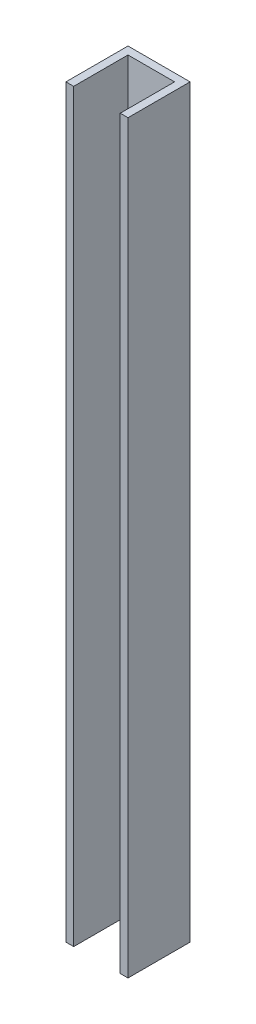
ISO-10303-21;
HEADER;
FILE_DESCRIPTION(('STEP AP214'),'2;1');
FILE_NAME('part.step','',(''),(''),'','','');
FILE_SCHEMA(('AUTOMOTIVE_DESIGN { 1 0 10303 214 1 1 1 1 }'));
ENDSEC;
DATA;
#1=APPLICATION_CONTEXT('core data for automotive mechanical design processes');
#2=APPLICATION_PROTOCOL_DEFINITION('international standard','automotive_design',2000,#1);
#3=PRODUCT_CONTEXT('',#1,'mechanical');
#4=PRODUCT('Part','Part','',(#3));
#5=PRODUCT_RELATED_PRODUCT_CATEGORY('part','',(#4));
#6=PRODUCT_DEFINITION_FORMATION('','',#4);
#7=PRODUCT_DEFINITION_CONTEXT('part definition',#1,'design');
#8=PRODUCT_DEFINITION('design','',#6,#7);
#9=PRODUCT_DEFINITION_SHAPE('','',#8);
#10=(LENGTH_UNIT() NAMED_UNIT(*) SI_UNIT(.MILLI.,.METRE.));
#11=(NAMED_UNIT(*) PLANE_ANGLE_UNIT() SI_UNIT($,.RADIAN.));
#12=(NAMED_UNIT(*) SI_UNIT($,.STERADIAN.) SOLID_ANGLE_UNIT());
#13=UNCERTAINTY_MEASURE_WITH_UNIT(LENGTH_MEASURE(1.E-05),#10,'distance_accuracy_value','');
#14=(GEOMETRIC_REPRESENTATION_CONTEXT(3) GLOBAL_UNCERTAINTY_ASSIGNED_CONTEXT((#13)) GLOBAL_UNIT_ASSIGNED_CONTEXT((#10,
#11,#12)) REPRESENTATION_CONTEXT('',''));
#15=CARTESIAN_POINT('',(0.,0.,0.));
#16=DIRECTION('',(0.,0.,1.));
#17=DIRECTION('',(1.,0.,0.));
#18=AXIS2_PLACEMENT_3D('',#15,#16,#17);
#19=CARTESIAN_POINT('',(0.,300.,0.));
#20=DIRECTION('',(0.,0.,-1.));
#21=DIRECTION('',(-1.,0.,0.));
#22=AXIS2_PLACEMENT_3D('',#19,#20,#21);
#23=PLANE('',#22);
#24=DIRECTION('',(1.,0.,0.));
#25=VECTOR('',#24,1.);
#26=CARTESIAN_POINT('',(0.,0.,0.));
#27=LINE('',#26,#25);
#28=CARTESIAN_POINT('',(0.,0.,0.));
#29=VERTEX_POINT('',#28);
#30=CARTESIAN_POINT('',(3.125,0.,0.));
#31=VERTEX_POINT('',#30);
#32=EDGE_CURVE('E129',#29,#31,#27,.T.);
#33=ORIENTED_EDGE('',*,*,#32,.T.);
#34=DIRECTION('',(0.,-1.,0.));
#35=VECTOR('',#34,1.);
#36=CARTESIAN_POINT('',(3.125,300.,0.));
#37=LINE('',#36,#35);
#38=CARTESIAN_POINT('',(3.125,300.,0.));
#39=VERTEX_POINT('',#38);
#40=EDGE_CURVE('E11',#39,#31,#37,.T.);
#41=ORIENTED_EDGE('',*,*,#40,.F.);
#42=DIRECTION('',(1.,0.,0.));
#43=VECTOR('',#42,1.);
#44=CARTESIAN_POINT('',(0.,300.,0.));
#45=LINE('',#44,#43);
#46=CARTESIAN_POINT('',(0.,300.,0.));
#47=VERTEX_POINT('',#46);
#48=EDGE_CURVE('E143',#47,#39,#45,.T.);
#49=ORIENTED_EDGE('',*,*,#48,.F.);
#50=DIRECTION('',(0.,-1.,0.));
#51=VECTOR('',#50,1.);
#52=CARTESIAN_POINT('',(0.,300.,0.));
#53=LINE('',#52,#51);
#54=EDGE_CURVE('E125',#47,#29,#53,.T.);
#55=ORIENTED_EDGE('',*,*,#54,.T.);
#56=EDGE_LOOP('',(#33,#41,#49,#55));
#57=FACE_BOUND('',#56,.T.);
#58=ADVANCED_FACE('F33',(#57),#23,.F.);
#59=CARTESIAN_POINT('',(3.125,300.,0.));
#60=DIRECTION('',(-1.,0.,0.));
#61=DIRECTION('',(0.,0.,1.));
#62=AXIS2_PLACEMENT_3D('',#59,#60,#61);
#63=PLANE('',#62);
#64=DIRECTION('',(0.,0.,-1.));
#65=VECTOR('',#64,1.);
#66=CARTESIAN_POINT('',(3.125,0.,0.));
#67=LINE('',#66,#65);
#68=CARTESIAN_POINT('',(3.125,0.,-21.875));
#69=VERTEX_POINT('',#68);
#70=EDGE_CURVE('E132',#31,#69,#67,.T.);
#71=ORIENTED_EDGE('',*,*,#70,.T.);
#72=DIRECTION('',(0.,-1.,0.));
#73=VECTOR('',#72,1.);
#74=CARTESIAN_POINT('',(3.125,300.,-21.875));
#75=LINE('',#74,#73);
#76=CARTESIAN_POINT('',(3.125,300.,-21.875));
#77=VERTEX_POINT('',#76);
#78=EDGE_CURVE('E41',#77,#69,#75,.T.);
#79=ORIENTED_EDGE('',*,*,#78,.F.);
#80=DIRECTION('',(0.,0.,-1.));
#81=VECTOR('',#80,1.);
#82=CARTESIAN_POINT('',(3.125,300.,0.));
#83=LINE('',#82,#81);
#84=EDGE_CURVE('E92',#39,#77,#83,.T.);
#85=ORIENTED_EDGE('',*,*,#84,.F.);
#86=ORIENTED_EDGE('',*,*,#40,.T.);
#87=EDGE_LOOP('',(#71,#79,#85,#86));
#88=FACE_BOUND('',#87,.T.);
#89=ADVANCED_FACE('F178',(#88),#63,.F.);
#90=CARTESIAN_POINT('',(3.125,300.,-21.875));
#91=DIRECTION('',(0.,0.,-1.));
#92=DIRECTION('',(-1.,0.,0.));
#93=AXIS2_PLACEMENT_3D('',#90,#91,#92);
#94=PLANE('',#93);
#95=DIRECTION('',(1.,0.,0.));
#96=VECTOR('',#95,1.);
#97=CARTESIAN_POINT('',(3.125,0.,-21.875));
#98=LINE('',#97,#96);
#99=CARTESIAN_POINT('',(21.875,0.,-21.875));
#100=VERTEX_POINT('',#99);
#101=EDGE_CURVE('E134',#69,#100,#98,.T.);
#102=ORIENTED_EDGE('',*,*,#101,.T.);
#103=DIRECTION('',(0.,-1.,0.));
#104=VECTOR('',#103,1.);
#105=CARTESIAN_POINT('',(21.875,300.,-21.875));
#106=LINE('',#105,#104);
#107=CARTESIAN_POINT('',(21.875,300.,-21.875));
#108=VERTEX_POINT('',#107);
#109=EDGE_CURVE('E150',#108,#100,#106,.T.);
#110=ORIENTED_EDGE('',*,*,#109,.F.);
#111=DIRECTION('',(1.,0.,0.));
#112=VECTOR('',#111,1.);
#113=CARTESIAN_POINT('',(3.125,300.,-21.875));
#114=LINE('',#113,#112);
#115=EDGE_CURVE('E158',#77,#108,#114,.T.);
#116=ORIENTED_EDGE('',*,*,#115,.F.);
#117=ORIENTED_EDGE('',*,*,#78,.T.);
#118=EDGE_LOOP('',(#102,#110,#116,#117));
#119=FACE_BOUND('',#118,.T.);
#120=ADVANCED_FACE('F156',(#119),#94,.F.);
#121=CARTESIAN_POINT('',(21.875,300.,-21.875));
#122=DIRECTION('',(1.,0.,0.));
#123=DIRECTION('',(0.,0.,-1.));
#124=AXIS2_PLACEMENT_3D('',#121,#122,#123);
#125=PLANE('',#124);
#126=DIRECTION('',(0.,0.,1.));
#127=VECTOR('',#126,1.);
#128=CARTESIAN_POINT('',(21.875,0.,-21.875));
#129=LINE('',#128,#127);
#130=CARTESIAN_POINT('',(21.875,0.,0.));
#131=VERTEX_POINT('',#130);
#132=EDGE_CURVE('E136',#100,#131,#129,.T.);
#133=ORIENTED_EDGE('',*,*,#132,.T.);
#134=DIRECTION('',(0.,-1.,0.));
#135=VECTOR('',#134,1.);
#136=CARTESIAN_POINT('',(21.875,300.,0.));
#137=LINE('',#136,#135);
#138=CARTESIAN_POINT('',(21.875,300.,0.));
#139=VERTEX_POINT('',#138);
#140=EDGE_CURVE('E147',#139,#131,#137,.T.);
#141=ORIENTED_EDGE('',*,*,#140,.F.);
#142=DIRECTION('',(0.,0.,1.));
#143=VECTOR('',#142,1.);
#144=CARTESIAN_POINT('',(21.875,300.,-21.875));
#145=LINE('',#144,#143);
#146=EDGE_CURVE('E170',#108,#139,#145,.T.);
#147=ORIENTED_EDGE('',*,*,#146,.F.);
#148=ORIENTED_EDGE('',*,*,#109,.T.);
#149=EDGE_LOOP('',(#133,#141,#147,#148));
#150=FACE_BOUND('',#149,.T.);
#151=ADVANCED_FACE('F166',(#150),#125,.F.);
#152=CARTESIAN_POINT('',(25.,300.,0.));
#153=DIRECTION('',(0.,0.,-1.));
#154=DIRECTION('',(-1.,0.,0.));
#155=AXIS2_PLACEMENT_3D('',#152,#153,#154);
#156=PLANE('',#155);
#157=DIRECTION('',(1.,0.,0.));
#158=VECTOR('',#157,1.);
#159=CARTESIAN_POINT('',(25.,0.,0.));
#160=LINE('',#159,#158);
#161=CARTESIAN_POINT('',(25.,0.,0.));
#162=VERTEX_POINT('',#161);
#163=EDGE_CURVE('E138',#131,#162,#160,.T.);
#164=ORIENTED_EDGE('',*,*,#163,.T.);
#165=DIRECTION('',(0.,-1.,0.));
#166=VECTOR('',#165,1.);
#167=CARTESIAN_POINT('',(25.,300.,0.));
#168=LINE('',#167,#166);
#169=CARTESIAN_POINT('',(25.,300.,0.));
#170=VERTEX_POINT('',#169);
#171=EDGE_CURVE('E120',#170,#162,#168,.T.);
#172=ORIENTED_EDGE('',*,*,#171,.F.);
#173=DIRECTION('',(1.,0.,0.));
#174=VECTOR('',#173,1.);
#175=CARTESIAN_POINT('',(25.,300.,0.));
#176=LINE('',#175,#174);
#177=EDGE_CURVE('E111',#139,#170,#176,.T.);
#178=ORIENTED_EDGE('',*,*,#177,.F.);
#179=ORIENTED_EDGE('',*,*,#140,.T.);
#180=EDGE_LOOP('',(#164,#172,#178,#179));
#181=FACE_BOUND('',#180,.T.);
#182=ADVANCED_FACE('F169',(#181),#156,.F.);
#183=CARTESIAN_POINT('',(25.,300.,-25.));
#184=DIRECTION('',(-1.,0.,0.));
#185=DIRECTION('',(0.,0.,1.));
#186=AXIS2_PLACEMENT_3D('',#183,#184,#185);
#187=PLANE('',#186);
#188=DIRECTION('',(0.,0.,-1.));
#189=VECTOR('',#188,1.);
#190=CARTESIAN_POINT('',(25.,0.,-25.));
#191=LINE('',#190,#189);
#192=CARTESIAN_POINT('',(25.,0.,-25.));
#193=VERTEX_POINT('',#192);
#194=EDGE_CURVE('E119',#162,#193,#191,.T.);
#195=ORIENTED_EDGE('',*,*,#194,.T.);
#196=DIRECTION('',(0.,-1.,0.));
#197=VECTOR('',#196,1.);
#198=CARTESIAN_POINT('',(25.,300.,-25.));
#199=LINE('',#198,#197);
#200=CARTESIAN_POINT('',(25.,300.,-25.));
#201=VERTEX_POINT('',#200);
#202=EDGE_CURVE('E116',#201,#193,#199,.T.);
#203=ORIENTED_EDGE('',*,*,#202,.F.);
#204=DIRECTION('',(0.,0.,-1.));
#205=VECTOR('',#204,1.);
#206=CARTESIAN_POINT('',(25.,300.,-25.));
#207=LINE('',#206,#205);
#208=EDGE_CURVE('E105',#170,#201,#207,.T.);
#209=ORIENTED_EDGE('',*,*,#208,.F.);
#210=ORIENTED_EDGE('',*,*,#171,.T.);
#211=EDGE_LOOP('',(#195,#203,#209,#210));
#212=FACE_BOUND('',#211,.T.);
#213=ADVANCED_FACE('F117',(#212),#187,.F.);
#214=CARTESIAN_POINT('',(0.,300.,-25.));
#215=DIRECTION('',(0.,0.,1.));
#216=DIRECTION('',(1.,0.,0.));
#217=AXIS2_PLACEMENT_3D('',#214,#215,#216);
#218=PLANE('',#217);
#219=DIRECTION('',(-1.,0.,0.));
#220=VECTOR('',#219,1.);
#221=CARTESIAN_POINT('',(0.,0.,-25.));
#222=LINE('',#221,#220);
#223=CARTESIAN_POINT('',(0.,0.,-25.));
#224=VERTEX_POINT('',#223);
#225=EDGE_CURVE('E78',#193,#224,#222,.T.);
#226=ORIENTED_EDGE('',*,*,#225,.T.);
#227=DIRECTION('',(0.,-1.,0.));
#228=VECTOR('',#227,1.);
#229=CARTESIAN_POINT('',(0.,300.,-25.));
#230=LINE('',#229,#228);
#231=CARTESIAN_POINT('',(0.,300.,-25.));
#232=VERTEX_POINT('',#231);
#233=EDGE_CURVE('E121',#232,#224,#230,.T.);
#234=ORIENTED_EDGE('',*,*,#233,.F.);
#235=DIRECTION('',(-1.,0.,0.));
#236=VECTOR('',#235,1.);
#237=CARTESIAN_POINT('',(0.,300.,-25.));
#238=LINE('',#237,#236);
#239=EDGE_CURVE('E109',#201,#232,#238,.T.);
#240=ORIENTED_EDGE('',*,*,#239,.F.);
#241=ORIENTED_EDGE('',*,*,#202,.T.);
#242=EDGE_LOOP('',(#226,#234,#240,#241));
#243=FACE_BOUND('',#242,.T.);
#244=ADVANCED_FACE('F123',(#243),#218,.F.);
#245=CARTESIAN_POINT('',(0.,300.,0.));
#246=DIRECTION('',(1.,0.,0.));
#247=DIRECTION('',(0.,0.,-1.));
#248=AXIS2_PLACEMENT_3D('',#245,#246,#247);
#249=PLANE('',#248);
#250=DIRECTION('',(0.,0.,1.));
#251=VECTOR('',#250,1.);
#252=CARTESIAN_POINT('',(0.,0.,0.));
#253=LINE('',#252,#251);
#254=EDGE_CURVE('E84',#224,#29,#253,.T.);
#255=ORIENTED_EDGE('',*,*,#254,.T.);
#256=ORIENTED_EDGE('',*,*,#54,.F.);
#257=DIRECTION('',(0.,0.,1.));
#258=VECTOR('',#257,1.);
#259=CARTESIAN_POINT('',(0.,300.,0.));
#260=LINE('',#259,#258);
#261=EDGE_CURVE('E49',#232,#47,#260,.T.);
#262=ORIENTED_EDGE('',*,*,#261,.F.);
#263=ORIENTED_EDGE('',*,*,#233,.T.);
#264=EDGE_LOOP('',(#255,#256,#262,#263));
#265=FACE_BOUND('',#264,.T.);
#266=ADVANCED_FACE('F194',(#265),#249,.F.);
#267=CARTESIAN_POINT('',(0.,300.,0.));
#268=DIRECTION('',(0.,1.,0.));
#269=DIRECTION('',(0.,0.,1.));
#270=AXIS2_PLACEMENT_3D('',#267,#268,#269);
#271=PLANE('',#270);
#272=ORIENTED_EDGE('',*,*,#48,.T.);
#273=ORIENTED_EDGE('',*,*,#84,.T.);
#274=ORIENTED_EDGE('',*,*,#115,.T.);
#275=ORIENTED_EDGE('',*,*,#146,.T.);
#276=ORIENTED_EDGE('',*,*,#177,.T.);
#277=ORIENTED_EDGE('',*,*,#208,.T.);
#278=ORIENTED_EDGE('',*,*,#239,.T.);
#279=ORIENTED_EDGE('',*,*,#261,.T.);
#280=EDGE_LOOP('',(#272,#273,#274,#275,#276,#277,#278,#279));
#281=FACE_BOUND('',#280,.T.);
#282=ADVANCED_FACE('F107',(#281),#271,.T.);
#283=CARTESIAN_POINT('',(0.,0.,0.));
#284=DIRECTION('',(0.,1.,0.));
#285=DIRECTION('',(0.,0.,1.));
#286=AXIS2_PLACEMENT_3D('',#283,#284,#285);
#287=PLANE('',#286);
#288=ORIENTED_EDGE('',*,*,#32,.F.);
#289=ORIENTED_EDGE('',*,*,#254,.F.);
#290=ORIENTED_EDGE('',*,*,#225,.F.);
#291=ORIENTED_EDGE('',*,*,#194,.F.);
#292=ORIENTED_EDGE('',*,*,#163,.F.);
#293=ORIENTED_EDGE('',*,*,#132,.F.);
#294=ORIENTED_EDGE('',*,*,#101,.F.);
#295=ORIENTED_EDGE('',*,*,#70,.F.);
#296=EDGE_LOOP('',(#288,#289,#290,#291,#292,#293,#294,#295));
#297=FACE_BOUND('',#296,.T.);
#298=ADVANCED_FACE('F162',(#297),#287,.F.);
#299=CLOSED_SHELL('',(#58,#89,#120,#151,#182,#213,#244,#266,#282,#298));
#300=MANIFOLD_SOLID_BREP('B2',#299);
#301=ADVANCED_BREP_SHAPE_REPRESENTATION('',(#18,#300),#14);
#302=SHAPE_DEFINITION_REPRESENTATION(#9,#301);
ENDSEC;
END-ISO-10303-21;
